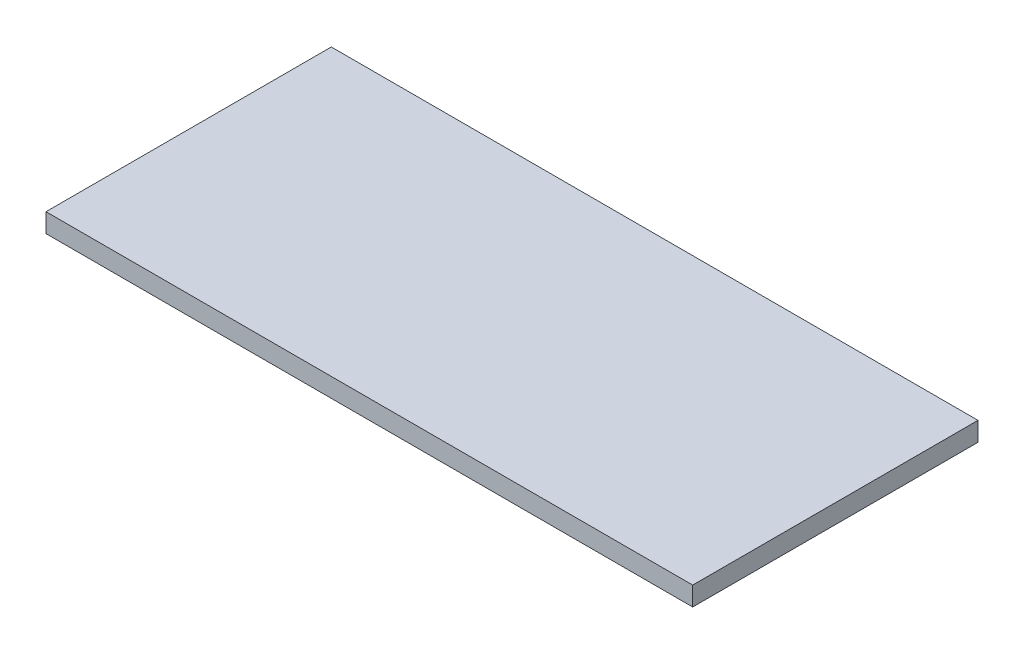
ISO-10303-21;
HEADER;
FILE_DESCRIPTION(('STEP AP214'),'2;1');
FILE_NAME('part.step','',(''),(''),'','','');
FILE_SCHEMA(('AUTOMOTIVE_DESIGN { 1 0 10303 214 1 1 1 1 }'));
ENDSEC;
DATA;
#1=APPLICATION_CONTEXT('core data for automotive mechanical design processes');
#2=APPLICATION_PROTOCOL_DEFINITION('international standard','automotive_design',2000,#1);
#3=PRODUCT_CONTEXT('',#1,'mechanical');
#4=PRODUCT('Part','Part','',(#3));
#5=PRODUCT_RELATED_PRODUCT_CATEGORY('part','',(#4));
#6=PRODUCT_DEFINITION_FORMATION('','',#4);
#7=PRODUCT_DEFINITION_CONTEXT('part definition',#1,'design');
#8=PRODUCT_DEFINITION('design','',#6,#7);
#9=PRODUCT_DEFINITION_SHAPE('','',#8);
#10=(LENGTH_UNIT() NAMED_UNIT(*) SI_UNIT(.MILLI.,.METRE.));
#11=(NAMED_UNIT(*) PLANE_ANGLE_UNIT() SI_UNIT($,.RADIAN.));
#12=(NAMED_UNIT(*) SI_UNIT($,.STERADIAN.) SOLID_ANGLE_UNIT());
#13=UNCERTAINTY_MEASURE_WITH_UNIT(LENGTH_MEASURE(1.E-05),#10,'distance_accuracy_value','');
#14=(GEOMETRIC_REPRESENTATION_CONTEXT(3) GLOBAL_UNCERTAINTY_ASSIGNED_CONTEXT((#13)) GLOBAL_UNIT_ASSIGNED_CONTEXT((#10,
#11,#12)) REPRESENTATION_CONTEXT('',''));
#15=CARTESIAN_POINT('',(0.,0.,0.));
#16=DIRECTION('',(0.,0.,1.));
#17=DIRECTION('',(1.,0.,0.));
#18=AXIS2_PLACEMENT_3D('',#15,#16,#17);
#19=CARTESIAN_POINT('',(0.,2.,0.));
#20=DIRECTION('',(1.,0.,0.));
#21=DIRECTION('',(0.,0.,-1.));
#22=AXIS2_PLACEMENT_3D('',#19,#20,#21);
#23=PLANE('',#22);
#24=DIRECTION('',(0.,0.,1.));
#25=VECTOR('',#24,1.);
#26=CARTESIAN_POINT('',(0.,0.,0.));
#27=LINE('',#26,#25);
#28=CARTESIAN_POINT('',(0.,0.,-30.));
#29=VERTEX_POINT('',#28);
#30=CARTESIAN_POINT('',(0.,0.,0.));
#31=VERTEX_POINT('',#30);
#32=EDGE_CURVE('E98',#29,#31,#27,.T.);
#33=ORIENTED_EDGE('',*,*,#32,.T.);
#34=DIRECTION('',(0.,-1.,0.));
#35=VECTOR('',#34,1.);
#36=CARTESIAN_POINT('',(0.,2.,0.));
#37=LINE('',#36,#35);
#38=CARTESIAN_POINT('',(0.,2.,0.));
#39=VERTEX_POINT('',#38);
#40=EDGE_CURVE('E11',#39,#31,#37,.T.);
#41=ORIENTED_EDGE('',*,*,#40,.F.);
#42=DIRECTION('',(0.,0.,1.));
#43=VECTOR('',#42,1.);
#44=CARTESIAN_POINT('',(0.,2.,0.));
#45=LINE('',#44,#43);
#46=CARTESIAN_POINT('',(0.,2.,-30.));
#47=VERTEX_POINT('',#46);
#48=EDGE_CURVE('E86',#47,#39,#45,.T.);
#49=ORIENTED_EDGE('',*,*,#48,.F.);
#50=DIRECTION('',(0.,-1.,0.));
#51=VECTOR('',#50,1.);
#52=CARTESIAN_POINT('',(0.,2.,-30.));
#53=LINE('',#52,#51);
#54=EDGE_CURVE('E94',#47,#29,#53,.T.);
#55=ORIENTED_EDGE('',*,*,#54,.T.);
#56=EDGE_LOOP('',(#33,#41,#49,#55));
#57=FACE_BOUND('',#56,.T.);
#58=ADVANCED_FACE('F35',(#57),#23,.F.);
#59=CARTESIAN_POINT('',(0.,2.,0.));
#60=DIRECTION('',(0.,0.,-1.));
#61=DIRECTION('',(-1.,0.,0.));
#62=AXIS2_PLACEMENT_3D('',#59,#60,#61);
#63=PLANE('',#62);
#64=DIRECTION('',(1.,0.,0.));
#65=VECTOR('',#64,1.);
#66=CARTESIAN_POINT('',(0.,0.,0.));
#67=LINE('',#66,#65);
#68=CARTESIAN_POINT('',(68.,0.,0.));
#69=VERTEX_POINT('',#68);
#70=EDGE_CURVE('E90',#31,#69,#67,.T.);
#71=ORIENTED_EDGE('',*,*,#70,.T.);
#72=DIRECTION('',(0.,-1.,0.));
#73=VECTOR('',#72,1.);
#74=CARTESIAN_POINT('',(68.,2.,0.));
#75=LINE('',#74,#73);
#76=CARTESIAN_POINT('',(68.,2.,0.));
#77=VERTEX_POINT('',#76);
#78=EDGE_CURVE('E43',#77,#69,#75,.T.);
#79=ORIENTED_EDGE('',*,*,#78,.F.);
#80=DIRECTION('',(1.,0.,0.));
#81=VECTOR('',#80,1.);
#82=CARTESIAN_POINT('',(0.,2.,0.));
#83=LINE('',#82,#81);
#84=EDGE_CURVE('E81',#39,#77,#83,.T.);
#85=ORIENTED_EDGE('',*,*,#84,.F.);
#86=ORIENTED_EDGE('',*,*,#40,.T.);
#87=EDGE_LOOP('',(#71,#79,#85,#86));
#88=FACE_BOUND('',#87,.T.);
#89=ADVANCED_FACE('F89',(#88),#63,.F.);
#90=CARTESIAN_POINT('',(68.,2.,0.));
#91=DIRECTION('',(-1.,0.,0.));
#92=DIRECTION('',(0.,0.,1.));
#93=AXIS2_PLACEMENT_3D('',#90,#91,#92);
#94=PLANE('',#93);
#95=DIRECTION('',(0.,0.,-1.));
#96=VECTOR('',#95,1.);
#97=CARTESIAN_POINT('',(68.,0.,0.));
#98=LINE('',#97,#96);
#99=CARTESIAN_POINT('',(68.,0.,-30.));
#100=VERTEX_POINT('',#99);
#101=EDGE_CURVE('E68',#69,#100,#98,.T.);
#102=ORIENTED_EDGE('',*,*,#101,.T.);
#103=DIRECTION('',(0.,-1.,0.));
#104=VECTOR('',#103,1.);
#105=CARTESIAN_POINT('',(68.,2.,-30.));
#106=LINE('',#105,#104);
#107=CARTESIAN_POINT('',(68.,2.,-30.));
#108=VERTEX_POINT('',#107);
#109=EDGE_CURVE('E91',#108,#100,#106,.T.);
#110=ORIENTED_EDGE('',*,*,#109,.F.);
#111=DIRECTION('',(0.,0.,-1.));
#112=VECTOR('',#111,1.);
#113=CARTESIAN_POINT('',(68.,2.,0.));
#114=LINE('',#113,#112);
#115=EDGE_CURVE('E84',#77,#108,#114,.T.);
#116=ORIENTED_EDGE('',*,*,#115,.F.);
#117=ORIENTED_EDGE('',*,*,#78,.T.);
#118=EDGE_LOOP('',(#102,#110,#116,#117));
#119=FACE_BOUND('',#118,.T.);
#120=ADVANCED_FACE('F92',(#119),#94,.F.);
#121=CARTESIAN_POINT('',(0.,2.,-30.));
#122=DIRECTION('',(0.,0.,1.));
#123=DIRECTION('',(1.,0.,0.));
#124=AXIS2_PLACEMENT_3D('',#121,#122,#123);
#125=PLANE('',#124);
#126=DIRECTION('',(-1.,0.,0.));
#127=VECTOR('',#126,1.);
#128=CARTESIAN_POINT('',(0.,0.,-30.));
#129=LINE('',#128,#127);
#130=EDGE_CURVE('E74',#100,#29,#129,.T.);
#131=ORIENTED_EDGE('',*,*,#130,.T.);
#132=ORIENTED_EDGE('',*,*,#54,.F.);
#133=DIRECTION('',(-1.,0.,0.));
#134=VECTOR('',#133,1.);
#135=CARTESIAN_POINT('',(0.,2.,-30.));
#136=LINE('',#135,#134);
#137=EDGE_CURVE('E51',#108,#47,#136,.T.);
#138=ORIENTED_EDGE('',*,*,#137,.F.);
#139=ORIENTED_EDGE('',*,*,#109,.T.);
#140=EDGE_LOOP('',(#131,#132,#138,#139));
#141=FACE_BOUND('',#140,.T.);
#142=ADVANCED_FACE('F105',(#141),#125,.F.);
#143=CARTESIAN_POINT('',(0.,2.,0.));
#144=DIRECTION('',(0.,-1.,0.));
#145=DIRECTION('',(0.,0.,-1.));
#146=AXIS2_PLACEMENT_3D('',#143,#144,#145);
#147=PLANE('',#146);
#148=ORIENTED_EDGE('',*,*,#48,.T.);
#149=ORIENTED_EDGE('',*,*,#84,.T.);
#150=ORIENTED_EDGE('',*,*,#115,.T.);
#151=ORIENTED_EDGE('',*,*,#137,.T.);
#152=EDGE_LOOP('',(#148,#149,#150,#151));
#153=FACE_BOUND('',#152,.T.);
#154=ADVANCED_FACE('F82',(#153),#147,.F.);
#155=CARTESIAN_POINT('',(0.,0.,0.));
#156=DIRECTION('',(0.,-1.,0.));
#157=DIRECTION('',(0.,0.,-1.));
#158=AXIS2_PLACEMENT_3D('',#155,#156,#157);
#159=PLANE('',#158);
#160=ORIENTED_EDGE('',*,*,#32,.F.);
#161=ORIENTED_EDGE('',*,*,#130,.F.);
#162=ORIENTED_EDGE('',*,*,#101,.F.);
#163=ORIENTED_EDGE('',*,*,#70,.F.);
#164=EDGE_LOOP('',(#160,#161,#162,#163));
#165=FACE_BOUND('',#164,.T.);
#166=ADVANCED_FACE('F108',(#165),#159,.T.);
#167=CLOSED_SHELL('',(#58,#89,#120,#142,#154,#166));
#168=MANIFOLD_SOLID_BREP('B2',#167);
#169=ADVANCED_BREP_SHAPE_REPRESENTATION('',(#18,#168),#14);
#170=SHAPE_DEFINITION_REPRESENTATION(#9,#169);
ENDSEC;
END-ISO-10303-21;
